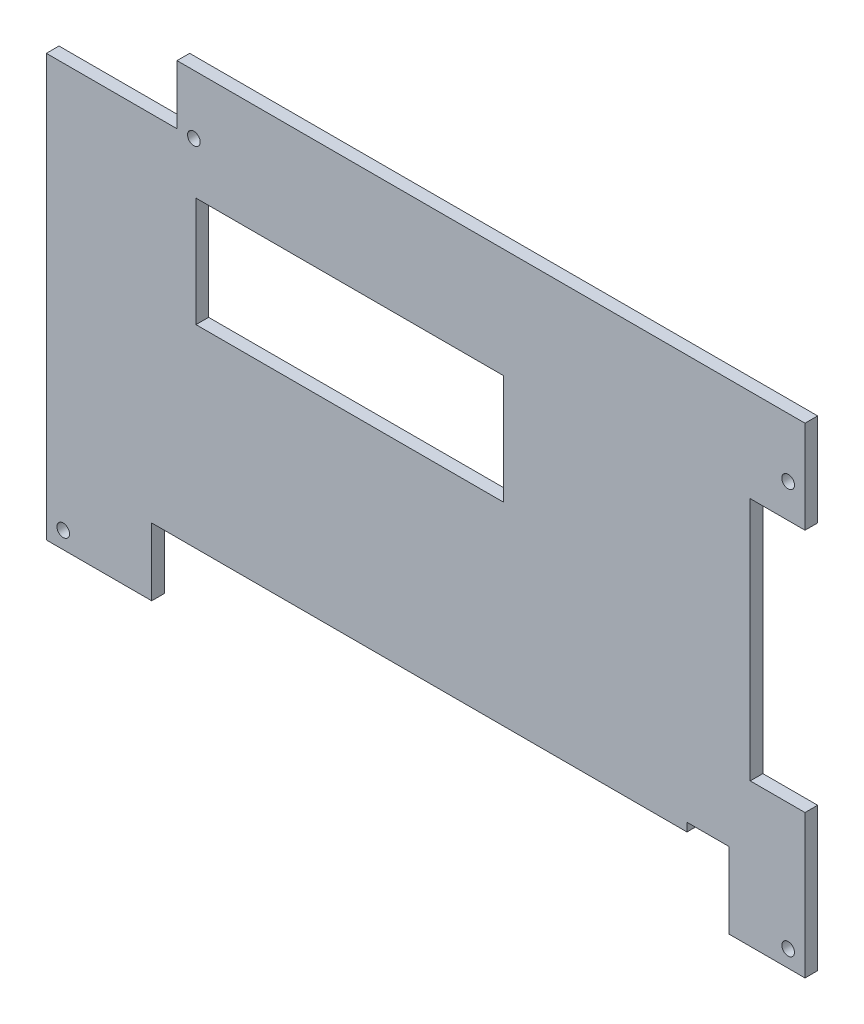
ISO-10303-21;
HEADER;
FILE_DESCRIPTION(('STEP AP214'),'2;1');
FILE_NAME('part.step','',(''),(''),'','','');
FILE_SCHEMA(('AUTOMOTIVE_DESIGN { 1 0 10303 214 1 1 1 1 }'));
ENDSEC;
DATA;
#1=APPLICATION_CONTEXT('core data for automotive mechanical design processes');
#2=APPLICATION_PROTOCOL_DEFINITION('international standard','automotive_design',2000,#1);
#3=PRODUCT_CONTEXT('',#1,'mechanical');
#4=PRODUCT('Part','Part','',(#3));
#5=PRODUCT_RELATED_PRODUCT_CATEGORY('part','',(#4));
#6=PRODUCT_DEFINITION_FORMATION('','',#4);
#7=PRODUCT_DEFINITION_CONTEXT('part definition',#1,'design');
#8=PRODUCT_DEFINITION('design','',#6,#7);
#9=PRODUCT_DEFINITION_SHAPE('','',#8);
#10=(LENGTH_UNIT() NAMED_UNIT(*) SI_UNIT(.MILLI.,.METRE.));
#11=(NAMED_UNIT(*) PLANE_ANGLE_UNIT() SI_UNIT($,.RADIAN.));
#12=(NAMED_UNIT(*) SI_UNIT($,.STERADIAN.) SOLID_ANGLE_UNIT());
#13=UNCERTAINTY_MEASURE_WITH_UNIT(LENGTH_MEASURE(1.E-05),#10,'distance_accuracy_value','');
#14=(GEOMETRIC_REPRESENTATION_CONTEXT(3) GLOBAL_UNCERTAINTY_ASSIGNED_CONTEXT((#13)) GLOBAL_UNIT_ASSIGNED_CONTEXT((#10,
#11,#12)) REPRESENTATION_CONTEXT('',''));
#15=CARTESIAN_POINT('',(0.,0.,0.));
#16=DIRECTION('',(0.,0.,1.));
#17=DIRECTION('',(1.,0.,0.));
#18=AXIS2_PLACEMENT_3D('',#15,#16,#17);
#19=CARTESIAN_POINT('',(-40.,9.00000000000001,-3.));
#20=DIRECTION('',(-1.,0.,0.));
#21=DIRECTION('',(0.,-1.,0.));
#22=AXIS2_PLACEMENT_3D('',#19,#20,#21);
#23=PLANE('',#22);
#24=DIRECTION('',(0.,-1.,0.));
#25=VECTOR('',#24,1.);
#26=CARTESIAN_POINT('',(-40.,9.00000000000001,0.));
#27=LINE('',#26,#25);
#28=CARTESIAN_POINT('',(-40.,9.00000000000001,0.));
#29=VERTEX_POINT('',#28);
#30=CARTESIAN_POINT('',(-40.,-91.,0.));
#31=VERTEX_POINT('',#30);
#32=EDGE_CURVE('E227',#29,#31,#27,.T.);
#33=ORIENTED_EDGE('',*,*,#32,.F.);
#34=DIRECTION('',(0.,0.,1.));
#35=VECTOR('',#34,1.);
#36=CARTESIAN_POINT('',(-40.,9.00000000000001,-3.));
#37=LINE('',#36,#35);
#38=CARTESIAN_POINT('',(-40.,9.00000000000001,-3.));
#39=VERTEX_POINT('',#38);
#40=EDGE_CURVE('E11',#39,#29,#37,.T.);
#41=ORIENTED_EDGE('',*,*,#40,.F.);
#42=DIRECTION('',(0.,-1.,0.));
#43=VECTOR('',#42,1.);
#44=CARTESIAN_POINT('',(-40.,9.00000000000001,-3.));
#45=LINE('',#44,#43);
#46=CARTESIAN_POINT('',(-40.,-91.,-3.));
#47=VERTEX_POINT('',#46);
#48=EDGE_CURVE('E230',#39,#47,#45,.T.);
#49=ORIENTED_EDGE('',*,*,#48,.T.);
#50=DIRECTION('',(0.,0.,1.));
#51=VECTOR('',#50,1.);
#52=CARTESIAN_POINT('',(-40.,-91.,-3.));
#53=LINE('',#52,#51);
#54=EDGE_CURVE('E35',#47,#31,#53,.T.);
#55=ORIENTED_EDGE('',*,*,#54,.T.);
#56=EDGE_LOOP('',(#33,#41,#49,#55));
#57=FACE_BOUND('',#56,.T.);
#58=ADVANCED_FACE('F32',(#57),#23,.T.);
#59=CARTESIAN_POINT('',(-40.,9.00000000000001,-3.));
#60=DIRECTION('',(0.,1.,0.));
#61=DIRECTION('',(0.,0.,1.));
#62=AXIS2_PLACEMENT_3D('',#59,#60,#61);
#63=PLANE('',#62);
#64=DIRECTION('',(-1.,0.,0.));
#65=VECTOR('',#64,1.);
#66=CARTESIAN_POINT('',(-40.,9.00000000000001,0.));
#67=LINE('',#66,#65);
#68=CARTESIAN_POINT('',(-8.99999999999999,9.00000000000001,0.));
#69=VERTEX_POINT('',#68);
#70=EDGE_CURVE('E234',#69,#29,#67,.T.);
#71=ORIENTED_EDGE('',*,*,#70,.F.);
#72=DIRECTION('',(0.,0.,1.));
#73=VECTOR('',#72,1.);
#74=CARTESIAN_POINT('',(-8.99999999999999,9.00000000000001,-3.));
#75=LINE('',#74,#73);
#76=CARTESIAN_POINT('',(-8.99999999999999,9.00000000000001,-3.));
#77=VERTEX_POINT('',#76);
#78=EDGE_CURVE('E40',#77,#69,#75,.T.);
#79=ORIENTED_EDGE('',*,*,#78,.F.);
#80=DIRECTION('',(-1.,0.,0.));
#81=VECTOR('',#80,1.);
#82=CARTESIAN_POINT('',(-40.,9.00000000000001,-3.));
#83=LINE('',#82,#81);
#84=EDGE_CURVE('E276',#77,#39,#83,.T.);
#85=ORIENTED_EDGE('',*,*,#84,.T.);
#86=ORIENTED_EDGE('',*,*,#40,.T.);
#87=EDGE_LOOP('',(#71,#79,#85,#86));
#88=FACE_BOUND('',#87,.T.);
#89=ADVANCED_FACE('F363',(#88),#63,.T.);
#90=CARTESIAN_POINT('',(-8.99999999999999,23.,-3.));
#91=DIRECTION('',(-1.,0.,0.));
#92=DIRECTION('',(0.,0.,1.));
#93=AXIS2_PLACEMENT_3D('',#90,#91,#92);
#94=PLANE('',#93);
#95=DIRECTION('',(0.,-1.,0.));
#96=VECTOR('',#95,1.);
#97=CARTESIAN_POINT('',(-8.99999999999999,23.,0.));
#98=LINE('',#97,#96);
#99=CARTESIAN_POINT('',(-8.99999999999999,23.,0.));
#100=VERTEX_POINT('',#99);
#101=EDGE_CURVE('E320',#100,#69,#98,.T.);
#102=ORIENTED_EDGE('',*,*,#101,.F.);
#103=DIRECTION('',(0.,0.,1.));
#104=VECTOR('',#103,1.);
#105=CARTESIAN_POINT('',(-8.99999999999999,23.,-3.));
#106=LINE('',#105,#104);
#107=CARTESIAN_POINT('',(-8.99999999999999,23.,-3.));
#108=VERTEX_POINT('',#107);
#109=EDGE_CURVE('E326',#108,#100,#106,.T.);
#110=ORIENTED_EDGE('',*,*,#109,.F.);
#111=DIRECTION('',(0.,-1.,0.));
#112=VECTOR('',#111,1.);
#113=CARTESIAN_POINT('',(-8.99999999999999,23.,-3.));
#114=LINE('',#113,#112);
#115=EDGE_CURVE('E273',#108,#77,#114,.T.);
#116=ORIENTED_EDGE('',*,*,#115,.T.);
#117=ORIENTED_EDGE('',*,*,#78,.T.);
#118=EDGE_LOOP('',(#102,#110,#116,#117));
#119=FACE_BOUND('',#118,.T.);
#120=ADVANCED_FACE('F415',(#119),#94,.T.);
#121=CARTESIAN_POINT('',(140.,23.,-3.));
#122=DIRECTION('',(0.,1.,0.));
#123=DIRECTION('',(-1.,0.,0.));
#124=AXIS2_PLACEMENT_3D('',#121,#122,#123);
#125=PLANE('',#124);
#126=DIRECTION('',(-1.,0.,0.));
#127=VECTOR('',#126,1.);
#128=CARTESIAN_POINT('',(140.,23.,0.));
#129=LINE('',#128,#127);
#130=CARTESIAN_POINT('',(140.,23.,0.));
#131=VERTEX_POINT('',#130);
#132=EDGE_CURVE('E317',#131,#100,#129,.T.);
#133=ORIENTED_EDGE('',*,*,#132,.F.);
#134=DIRECTION('',(0.,0.,1.));
#135=VECTOR('',#134,1.);
#136=CARTESIAN_POINT('',(140.,23.,-3.));
#137=LINE('',#136,#135);
#138=CARTESIAN_POINT('',(140.,23.,-3.));
#139=VERTEX_POINT('',#138);
#140=EDGE_CURVE('E328',#139,#131,#137,.T.);
#141=ORIENTED_EDGE('',*,*,#140,.F.);
#142=DIRECTION('',(-1.,0.,0.));
#143=VECTOR('',#142,1.);
#144=CARTESIAN_POINT('',(140.,23.,-3.));
#145=LINE('',#144,#143);
#146=EDGE_CURVE('E270',#139,#108,#145,.T.);
#147=ORIENTED_EDGE('',*,*,#146,.T.);
#148=ORIENTED_EDGE('',*,*,#109,.T.);
#149=EDGE_LOOP('',(#133,#141,#147,#148));
#150=FACE_BOUND('',#149,.T.);
#151=ADVANCED_FACE('F413',(#150),#125,.T.);
#152=CARTESIAN_POINT('',(140.,1.,-3.));
#153=DIRECTION('',(1.,0.,0.));
#154=DIRECTION('',(0.,0.,-1.));
#155=AXIS2_PLACEMENT_3D('',#152,#153,#154);
#156=PLANE('',#155);
#157=DIRECTION('',(0.,1.,0.));
#158=VECTOR('',#157,1.);
#159=CARTESIAN_POINT('',(140.,1.,0.));
#160=LINE('',#159,#158);
#161=CARTESIAN_POINT('',(140.,1.,0.));
#162=VERTEX_POINT('',#161);
#163=EDGE_CURVE('E314',#162,#131,#160,.T.);
#164=ORIENTED_EDGE('',*,*,#163,.F.);
#165=DIRECTION('',(0.,0.,1.));
#166=VECTOR('',#165,1.);
#167=CARTESIAN_POINT('',(140.,1.,-3.));
#168=LINE('',#167,#166);
#169=CARTESIAN_POINT('',(140.,1.,-3.));
#170=VERTEX_POINT('',#169);
#171=EDGE_CURVE('E330',#170,#162,#168,.T.);
#172=ORIENTED_EDGE('',*,*,#171,.F.);
#173=DIRECTION('',(0.,1.,0.));
#174=VECTOR('',#173,1.);
#175=CARTESIAN_POINT('',(140.,1.,-3.));
#176=LINE('',#175,#174);
#177=EDGE_CURVE('E267',#170,#139,#176,.T.);
#178=ORIENTED_EDGE('',*,*,#177,.T.);
#179=ORIENTED_EDGE('',*,*,#140,.T.);
#180=EDGE_LOOP('',(#164,#172,#178,#179));
#181=FACE_BOUND('',#180,.T.);
#182=ADVANCED_FACE('F409',(#181),#156,.T.);
#183=CARTESIAN_POINT('',(127.,1.,-3.));
#184=DIRECTION('',(0.,-1.,0.));
#185=DIRECTION('',(0.,0.,-1.));
#186=AXIS2_PLACEMENT_3D('',#183,#184,#185);
#187=PLANE('',#186);
#188=DIRECTION('',(1.,0.,0.));
#189=VECTOR('',#188,1.);
#190=CARTESIAN_POINT('',(127.,1.,0.));
#191=LINE('',#190,#189);
#192=CARTESIAN_POINT('',(127.,1.,0.));
#193=VERTEX_POINT('',#192);
#194=EDGE_CURVE('E311',#193,#162,#191,.T.);
#195=ORIENTED_EDGE('',*,*,#194,.F.);
#196=DIRECTION('',(0.,0.,1.));
#197=VECTOR('',#196,1.);
#198=CARTESIAN_POINT('',(127.,1.,-3.));
#199=LINE('',#198,#197);
#200=CARTESIAN_POINT('',(127.,1.,-3.));
#201=VERTEX_POINT('',#200);
#202=EDGE_CURVE('E332',#201,#193,#199,.T.);
#203=ORIENTED_EDGE('',*,*,#202,.F.);
#204=DIRECTION('',(1.,0.,0.));
#205=VECTOR('',#204,1.);
#206=CARTESIAN_POINT('',(127.,1.,-3.));
#207=LINE('',#206,#205);
#208=EDGE_CURVE('E264',#201,#170,#207,.T.);
#209=ORIENTED_EDGE('',*,*,#208,.T.);
#210=ORIENTED_EDGE('',*,*,#171,.T.);
#211=EDGE_LOOP('',(#195,#203,#209,#210));
#212=FACE_BOUND('',#211,.T.);
#213=ADVANCED_FACE('F405',(#212),#187,.T.);
#214=CARTESIAN_POINT('',(127.,-57.,-3.));
#215=DIRECTION('',(1.,0.,0.));
#216=DIRECTION('',(0.,0.,-1.));
#217=AXIS2_PLACEMENT_3D('',#214,#215,#216);
#218=PLANE('',#217);
#219=DIRECTION('',(0.,1.,0.));
#220=VECTOR('',#219,1.);
#221=CARTESIAN_POINT('',(127.,-57.,0.));
#222=LINE('',#221,#220);
#223=CARTESIAN_POINT('',(127.,-57.,0.));
#224=VERTEX_POINT('',#223);
#225=EDGE_CURVE('E308',#224,#193,#222,.T.);
#226=ORIENTED_EDGE('',*,*,#225,.F.);
#227=DIRECTION('',(0.,0.,1.));
#228=VECTOR('',#227,1.);
#229=CARTESIAN_POINT('',(127.,-57.,-3.));
#230=LINE('',#229,#228);
#231=CARTESIAN_POINT('',(127.,-57.,-3.));
#232=VERTEX_POINT('',#231);
#233=EDGE_CURVE('E334',#232,#224,#230,.T.);
#234=ORIENTED_EDGE('',*,*,#233,.F.);
#235=DIRECTION('',(0.,1.,0.));
#236=VECTOR('',#235,1.);
#237=CARTESIAN_POINT('',(127.,-57.,-3.));
#238=LINE('',#237,#236);
#239=EDGE_CURVE('E261',#232,#201,#238,.T.);
#240=ORIENTED_EDGE('',*,*,#239,.T.);
#241=ORIENTED_EDGE('',*,*,#202,.T.);
#242=EDGE_LOOP('',(#226,#234,#240,#241));
#243=FACE_BOUND('',#242,.T.);
#244=ADVANCED_FACE('F401',(#243),#218,.T.);
#245=CARTESIAN_POINT('',(140.,-57.,-3.));
#246=DIRECTION('',(0.,1.,0.));
#247=DIRECTION('',(0.,0.,1.));
#248=AXIS2_PLACEMENT_3D('',#245,#246,#247);
#249=PLANE('',#248);
#250=DIRECTION('',(-1.,0.,0.));
#251=VECTOR('',#250,1.);
#252=CARTESIAN_POINT('',(140.,-57.,0.));
#253=LINE('',#252,#251);
#254=CARTESIAN_POINT('',(140.,-57.,0.));
#255=VERTEX_POINT('',#254);
#256=EDGE_CURVE('E305',#255,#224,#253,.T.);
#257=ORIENTED_EDGE('',*,*,#256,.F.);
#258=DIRECTION('',(0.,0.,1.));
#259=VECTOR('',#258,1.);
#260=CARTESIAN_POINT('',(140.,-57.,-3.));
#261=LINE('',#260,#259);
#262=CARTESIAN_POINT('',(140.,-57.,-3.));
#263=VERTEX_POINT('',#262);
#264=EDGE_CURVE('E336',#263,#255,#261,.T.);
#265=ORIENTED_EDGE('',*,*,#264,.F.);
#266=DIRECTION('',(-1.,0.,0.));
#267=VECTOR('',#266,1.);
#268=CARTESIAN_POINT('',(140.,-57.,-3.));
#269=LINE('',#268,#267);
#270=EDGE_CURVE('E258',#263,#232,#269,.T.);
#271=ORIENTED_EDGE('',*,*,#270,.T.);
#272=ORIENTED_EDGE('',*,*,#233,.T.);
#273=EDGE_LOOP('',(#257,#265,#271,#272));
#274=FACE_BOUND('',#273,.T.);
#275=ADVANCED_FACE('F397',(#274),#249,.T.);
#276=CARTESIAN_POINT('',(140.,-91.,-3.));
#277=DIRECTION('',(1.,0.,0.));
#278=DIRECTION('',(0.,0.,-1.));
#279=AXIS2_PLACEMENT_3D('',#276,#277,#278);
#280=PLANE('',#279);
#281=DIRECTION('',(0.,1.,0.));
#282=VECTOR('',#281,1.);
#283=CARTESIAN_POINT('',(140.,-91.,0.));
#284=LINE('',#283,#282);
#285=CARTESIAN_POINT('',(140.,-91.,0.));
#286=VERTEX_POINT('',#285);
#287=EDGE_CURVE('E302',#286,#255,#284,.T.);
#288=ORIENTED_EDGE('',*,*,#287,.F.);
#289=DIRECTION('',(0.,0.,1.));
#290=VECTOR('',#289,1.);
#291=CARTESIAN_POINT('',(140.,-91.,-3.));
#292=LINE('',#291,#290);
#293=CARTESIAN_POINT('',(140.,-91.,-3.));
#294=VERTEX_POINT('',#293);
#295=EDGE_CURVE('E338',#294,#286,#292,.T.);
#296=ORIENTED_EDGE('',*,*,#295,.F.);
#297=DIRECTION('',(0.,1.,0.));
#298=VECTOR('',#297,1.);
#299=CARTESIAN_POINT('',(140.,-91.,-3.));
#300=LINE('',#299,#298);
#301=EDGE_CURVE('E255',#294,#263,#300,.T.);
#302=ORIENTED_EDGE('',*,*,#301,.T.);
#303=ORIENTED_EDGE('',*,*,#264,.T.);
#304=EDGE_LOOP('',(#288,#296,#302,#303));
#305=FACE_BOUND('',#304,.T.);
#306=ADVANCED_FACE('F393',(#305),#280,.T.);
#307=CARTESIAN_POINT('',(122.,-91.,-3.));
#308=DIRECTION('',(0.,-1.,0.));
#309=DIRECTION('',(0.,0.,-1.));
#310=AXIS2_PLACEMENT_3D('',#307,#308,#309);
#311=PLANE('',#310);
#312=DIRECTION('',(1.,0.,0.));
#313=VECTOR('',#312,1.);
#314=CARTESIAN_POINT('',(122.,-91.,0.));
#315=LINE('',#314,#313);
#316=CARTESIAN_POINT('',(122.,-91.,0.));
#317=VERTEX_POINT('',#316);
#318=EDGE_CURVE('E299',#317,#286,#315,.T.);
#319=ORIENTED_EDGE('',*,*,#318,.F.);
#320=DIRECTION('',(0.,0.,1.));
#321=VECTOR('',#320,1.);
#322=CARTESIAN_POINT('',(122.,-91.,-3.));
#323=LINE('',#322,#321);
#324=CARTESIAN_POINT('',(122.,-91.,-3.));
#325=VERTEX_POINT('',#324);
#326=EDGE_CURVE('E340',#325,#317,#323,.T.);
#327=ORIENTED_EDGE('',*,*,#326,.F.);
#328=DIRECTION('',(1.,0.,0.));
#329=VECTOR('',#328,1.);
#330=CARTESIAN_POINT('',(122.,-91.,-3.));
#331=LINE('',#330,#329);
#332=EDGE_CURVE('E252',#325,#294,#331,.T.);
#333=ORIENTED_EDGE('',*,*,#332,.T.);
#334=ORIENTED_EDGE('',*,*,#295,.T.);
#335=EDGE_LOOP('',(#319,#327,#333,#334));
#336=FACE_BOUND('',#335,.T.);
#337=ADVANCED_FACE('F389',(#336),#311,.T.);
#338=CARTESIAN_POINT('',(122.,-73.,-3.));
#339=DIRECTION('',(-1.,0.,0.));
#340=DIRECTION('',(0.,0.,1.));
#341=AXIS2_PLACEMENT_3D('',#338,#339,#340);
#342=PLANE('',#341);
#343=DIRECTION('',(0.,-1.,0.));
#344=VECTOR('',#343,1.);
#345=CARTESIAN_POINT('',(122.,-73.,0.));
#346=LINE('',#345,#344);
#347=CARTESIAN_POINT('',(122.,-73.,0.));
#348=VERTEX_POINT('',#347);
#349=EDGE_CURVE('E296',#348,#317,#346,.T.);
#350=ORIENTED_EDGE('',*,*,#349,.F.);
#351=DIRECTION('',(0.,0.,1.));
#352=VECTOR('',#351,1.);
#353=CARTESIAN_POINT('',(122.,-73.,-3.));
#354=LINE('',#353,#352);
#355=CARTESIAN_POINT('',(122.,-73.,-3.));
#356=VERTEX_POINT('',#355);
#357=EDGE_CURVE('E342',#356,#348,#354,.T.);
#358=ORIENTED_EDGE('',*,*,#357,.F.);
#359=DIRECTION('',(0.,-1.,0.));
#360=VECTOR('',#359,1.);
#361=CARTESIAN_POINT('',(122.,-73.,-3.));
#362=LINE('',#361,#360);
#363=EDGE_CURVE('E249',#356,#325,#362,.T.);
#364=ORIENTED_EDGE('',*,*,#363,.T.);
#365=ORIENTED_EDGE('',*,*,#326,.T.);
#366=EDGE_LOOP('',(#350,#358,#364,#365));
#367=FACE_BOUND('',#366,.T.);
#368=ADVANCED_FACE('F385',(#367),#342,.T.);
#369=CARTESIAN_POINT('',(112.,-73.,-3.));
#370=DIRECTION('',(0.,-1.,0.));
#371=DIRECTION('',(0.,0.,-1.));
#372=AXIS2_PLACEMENT_3D('',#369,#370,#371);
#373=PLANE('',#372);
#374=DIRECTION('',(1.,0.,0.));
#375=VECTOR('',#374,1.);
#376=CARTESIAN_POINT('',(112.,-73.,0.));
#377=LINE('',#376,#375);
#378=CARTESIAN_POINT('',(112.,-73.,0.));
#379=VERTEX_POINT('',#378);
#380=EDGE_CURVE('E293',#379,#348,#377,.T.);
#381=ORIENTED_EDGE('',*,*,#380,.F.);
#382=DIRECTION('',(0.,0.,1.));
#383=VECTOR('',#382,1.);
#384=CARTESIAN_POINT('',(112.,-73.,-3.));
#385=LINE('',#384,#383);
#386=CARTESIAN_POINT('',(112.,-73.,-3.));
#387=VERTEX_POINT('',#386);
#388=EDGE_CURVE('E344',#387,#379,#385,.T.);
#389=ORIENTED_EDGE('',*,*,#388,.F.);
#390=DIRECTION('',(1.,0.,0.));
#391=VECTOR('',#390,1.);
#392=CARTESIAN_POINT('',(112.,-73.,-3.));
#393=LINE('',#392,#391);
#394=EDGE_CURVE('E246',#387,#356,#393,.T.);
#395=ORIENTED_EDGE('',*,*,#394,.T.);
#396=ORIENTED_EDGE('',*,*,#357,.T.);
#397=EDGE_LOOP('',(#381,#389,#395,#396));
#398=FACE_BOUND('',#397,.T.);
#399=ADVANCED_FACE('F381',(#398),#373,.T.);
#400=CARTESIAN_POINT('',(112.,-75.,-3.));
#401=DIRECTION('',(1.,0.,0.));
#402=DIRECTION('',(0.,0.,-1.));
#403=AXIS2_PLACEMENT_3D('',#400,#401,#402);
#404=PLANE('',#403);
#405=DIRECTION('',(0.,1.,0.));
#406=VECTOR('',#405,1.);
#407=CARTESIAN_POINT('',(112.,-75.,0.));
#408=LINE('',#407,#406);
#409=CARTESIAN_POINT('',(112.,-75.,0.));
#410=VERTEX_POINT('',#409);
#411=EDGE_CURVE('E290',#410,#379,#408,.T.);
#412=ORIENTED_EDGE('',*,*,#411,.F.);
#413=DIRECTION('',(0.,0.,1.));
#414=VECTOR('',#413,1.);
#415=CARTESIAN_POINT('',(112.,-75.,-3.));
#416=LINE('',#415,#414);
#417=CARTESIAN_POINT('',(112.,-75.,-3.));
#418=VERTEX_POINT('',#417);
#419=EDGE_CURVE('E346',#418,#410,#416,.T.);
#420=ORIENTED_EDGE('',*,*,#419,.F.);
#421=DIRECTION('',(0.,1.,0.));
#422=VECTOR('',#421,1.);
#423=CARTESIAN_POINT('',(112.,-75.,-3.));
#424=LINE('',#423,#422);
#425=EDGE_CURVE('E243',#418,#387,#424,.T.);
#426=ORIENTED_EDGE('',*,*,#425,.T.);
#427=ORIENTED_EDGE('',*,*,#388,.T.);
#428=EDGE_LOOP('',(#412,#420,#426,#427));
#429=FACE_BOUND('',#428,.T.);
#430=ADVANCED_FACE('F377',(#429),#404,.T.);
#431=CARTESIAN_POINT('',(-14.9999999999999,-75.,-3.));
#432=DIRECTION('',(0.,-1.,0.));
#433=DIRECTION('',(0.,0.,-1.));
#434=AXIS2_PLACEMENT_3D('',#431,#432,#433);
#435=PLANE('',#434);
#436=DIRECTION('',(1.,0.,0.));
#437=VECTOR('',#436,1.);
#438=CARTESIAN_POINT('',(-14.9999999999999,-75.,0.));
#439=LINE('',#438,#437);
#440=CARTESIAN_POINT('',(-14.9999999999999,-75.,0.));
#441=VERTEX_POINT('',#440);
#442=EDGE_CURVE('E287',#441,#410,#439,.T.);
#443=ORIENTED_EDGE('',*,*,#442,.F.);
#444=DIRECTION('',(0.,0.,1.));
#445=VECTOR('',#444,1.);
#446=CARTESIAN_POINT('',(-14.9999999999999,-75.,-3.));
#447=LINE('',#446,#445);
#448=CARTESIAN_POINT('',(-14.9999999999999,-75.,-3.));
#449=VERTEX_POINT('',#448);
#450=EDGE_CURVE('E348',#449,#441,#447,.T.);
#451=ORIENTED_EDGE('',*,*,#450,.F.);
#452=DIRECTION('',(1.,0.,0.));
#453=VECTOR('',#452,1.);
#454=CARTESIAN_POINT('',(-14.9999999999999,-75.,-3.));
#455=LINE('',#454,#453);
#456=EDGE_CURVE('E240',#449,#418,#455,.T.);
#457=ORIENTED_EDGE('',*,*,#456,.T.);
#458=ORIENTED_EDGE('',*,*,#419,.T.);
#459=EDGE_LOOP('',(#443,#451,#457,#458));
#460=FACE_BOUND('',#459,.T.);
#461=ADVANCED_FACE('F375',(#460),#435,.T.);
#462=CARTESIAN_POINT('',(-14.9999999999999,-91.,-3.));
#463=DIRECTION('',(1.,0.,0.));
#464=DIRECTION('',(0.,0.,-1.));
#465=AXIS2_PLACEMENT_3D('',#462,#463,#464);
#466=PLANE('',#465);
#467=DIRECTION('',(0.,1.,0.));
#468=VECTOR('',#467,1.);
#469=CARTESIAN_POINT('',(-14.9999999999999,-91.,0.));
#470=LINE('',#469,#468);
#471=CARTESIAN_POINT('',(-14.9999999999999,-91.,0.));
#472=VERTEX_POINT('',#471);
#473=EDGE_CURVE('E284',#472,#441,#470,.T.);
#474=ORIENTED_EDGE('',*,*,#473,.F.);
#475=DIRECTION('',(0.,0.,1.));
#476=VECTOR('',#475,1.);
#477=CARTESIAN_POINT('',(-14.9999999999999,-91.,-3.));
#478=LINE('',#477,#476);
#479=CARTESIAN_POINT('',(-14.9999999999999,-91.,-3.));
#480=VERTEX_POINT('',#479);
#481=EDGE_CURVE('E349',#480,#472,#478,.T.);
#482=ORIENTED_EDGE('',*,*,#481,.F.);
#483=DIRECTION('',(0.,1.,0.));
#484=VECTOR('',#483,1.);
#485=CARTESIAN_POINT('',(-14.9999999999999,-91.,-3.));
#486=LINE('',#485,#484);
#487=EDGE_CURVE('E237',#480,#449,#486,.T.);
#488=ORIENTED_EDGE('',*,*,#487,.T.);
#489=ORIENTED_EDGE('',*,*,#450,.T.);
#490=EDGE_LOOP('',(#474,#482,#488,#489));
#491=FACE_BOUND('',#490,.T.);
#492=ADVANCED_FACE('F371',(#491),#466,.T.);
#493=CARTESIAN_POINT('',(-40.,-91.,-3.));
#494=DIRECTION('',(0.,-1.,0.));
#495=DIRECTION('',(0.,0.,-1.));
#496=AXIS2_PLACEMENT_3D('',#493,#494,#495);
#497=PLANE('',#496);
#498=DIRECTION('',(1.,0.,0.));
#499=VECTOR('',#498,1.);
#500=CARTESIAN_POINT('',(-40.,-91.,0.));
#501=LINE('',#500,#499);
#502=EDGE_CURVE('E281',#31,#472,#501,.T.);
#503=ORIENTED_EDGE('',*,*,#502,.F.);
#504=ORIENTED_EDGE('',*,*,#54,.F.);
#505=DIRECTION('',(1.,0.,0.));
#506=VECTOR('',#505,1.);
#507=CARTESIAN_POINT('',(-40.,-91.,-3.));
#508=LINE('',#507,#506);
#509=EDGE_CURVE('E233',#47,#480,#508,.T.);
#510=ORIENTED_EDGE('',*,*,#509,.T.);
#511=ORIENTED_EDGE('',*,*,#481,.T.);
#512=EDGE_LOOP('',(#503,#504,#510,#511));
#513=FACE_BOUND('',#512,.T.);
#514=ADVANCED_FACE('F357',(#513),#497,.T.);
#515=CARTESIAN_POINT('',(0.,0.,-3.));
#516=DIRECTION('',(0.,0.,1.));
#517=DIRECTION('',(1.,0.,0.));
#518=AXIS2_PLACEMENT_3D('',#515,#516,#517);
#519=PLANE('',#518);
#520=DIRECTION('',(-1.,0.,0.));
#521=VECTOR('',#520,1.);
#522=CARTESIAN_POINT('',(-4.49999999999999,-3.,-3.));
#523=LINE('',#522,#521);
#524=CARTESIAN_POINT('',(68.5,-3.,-3.));
#525=VERTEX_POINT('',#524);
#526=CARTESIAN_POINT('',(-4.49999999999999,-3.,-3.));
#527=VERTEX_POINT('',#526);
#528=EDGE_CURVE('E177',#525,#527,#523,.T.);
#529=ORIENTED_EDGE('',*,*,#528,.T.);
#530=DIRECTION('',(0.,-1.,0.));
#531=VECTOR('',#530,1.);
#532=CARTESIAN_POINT('',(-4.49999999999999,-29.,-3.));
#533=LINE('',#532,#531);
#534=CARTESIAN_POINT('',(-4.49999999999999,-29.,-3.));
#535=VERTEX_POINT('',#534);
#536=EDGE_CURVE('E171',#527,#535,#533,.T.);
#537=ORIENTED_EDGE('',*,*,#536,.T.);
#538=DIRECTION('',(1.,0.,0.));
#539=VECTOR('',#538,1.);
#540=CARTESIAN_POINT('',(-4.49999999999999,-29.,-3.));
#541=LINE('',#540,#539);
#542=CARTESIAN_POINT('',(68.5,-29.,-3.));
#543=VERTEX_POINT('',#542);
#544=EDGE_CURVE('E180',#535,#543,#541,.T.);
#545=ORIENTED_EDGE('',*,*,#544,.T.);
#546=DIRECTION('',(0.,1.,0.));
#547=VECTOR('',#546,1.);
#548=CARTESIAN_POINT('',(68.5,-29.,-3.));
#549=LINE('',#548,#547);
#550=EDGE_CURVE('E48',#543,#525,#549,.T.);
#551=ORIENTED_EDGE('',*,*,#550,.T.);
#552=EDGE_LOOP('',(#529,#537,#545,#551));
#553=FACE_BOUND('',#552,.T.);
#554=CARTESIAN_POINT('',(-36.,-87.,-3.));
#555=DIRECTION('',(0.,0.,1.));
#556=DIRECTION('',(1.,0.,0.));
#557=AXIS2_PLACEMENT_3D('',#554,#555,#556);
#558=CIRCLE('',#557,1.5);
#559=CARTESIAN_POINT('',(-34.5,-87.,-3.));
#560=VERTEX_POINT('',#559);
#561=EDGE_CURVE('E206',#560,#560,#558,.T.);
#562=ORIENTED_EDGE('',*,*,#561,.T.);
#563=EDGE_LOOP('',(#562));
#564=FACE_BOUND('',#563,.T.);
#565=CARTESIAN_POINT('',(136.,-87.,-3.));
#566=DIRECTION('',(0.,0.,1.));
#567=DIRECTION('',(1.,0.,0.));
#568=AXIS2_PLACEMENT_3D('',#565,#566,#567);
#569=CIRCLE('',#568,1.5);
#570=CARTESIAN_POINT('',(137.5,-87.,-3.));
#571=VERTEX_POINT('',#570);
#572=EDGE_CURVE('E212',#571,#571,#569,.T.);
#573=ORIENTED_EDGE('',*,*,#572,.T.);
#574=EDGE_LOOP('',(#573));
#575=FACE_BOUND('',#574,.T.);
#576=CARTESIAN_POINT('',(136.,9.00000000000001,-3.));
#577=DIRECTION('',(0.,0.,1.));
#578=DIRECTION('',(1.,0.,0.));
#579=AXIS2_PLACEMENT_3D('',#576,#577,#578);
#580=CIRCLE('',#579,1.5);
#581=CARTESIAN_POINT('',(137.5,9.00000000000001,-3.));
#582=VERTEX_POINT('',#581);
#583=EDGE_CURVE('E218',#582,#582,#580,.T.);
#584=ORIENTED_EDGE('',*,*,#583,.T.);
#585=EDGE_LOOP('',(#584));
#586=FACE_BOUND('',#585,.T.);
#587=CARTESIAN_POINT('',(-4.99999999999999,9.00000000000001,-3.));
#588=DIRECTION('',(0.,0.,1.));
#589=DIRECTION('',(1.,0.,0.));
#590=AXIS2_PLACEMENT_3D('',#587,#588,#589);
#591=CIRCLE('',#590,1.49999999999999);
#592=CARTESIAN_POINT('',(-3.5,9.00000000000001,-3.));
#593=VERTEX_POINT('',#592);
#594=EDGE_CURVE('E224',#593,#593,#591,.T.);
#595=ORIENTED_EDGE('',*,*,#594,.T.);
#596=EDGE_LOOP('',(#595));
#597=FACE_BOUND('',#596,.T.);
#598=ORIENTED_EDGE('',*,*,#48,.F.);
#599=ORIENTED_EDGE('',*,*,#84,.F.);
#600=ORIENTED_EDGE('',*,*,#115,.F.);
#601=ORIENTED_EDGE('',*,*,#146,.F.);
#602=ORIENTED_EDGE('',*,*,#177,.F.);
#603=ORIENTED_EDGE('',*,*,#208,.F.);
#604=ORIENTED_EDGE('',*,*,#239,.F.);
#605=ORIENTED_EDGE('',*,*,#270,.F.);
#606=ORIENTED_EDGE('',*,*,#301,.F.);
#607=ORIENTED_EDGE('',*,*,#332,.F.);
#608=ORIENTED_EDGE('',*,*,#363,.F.);
#609=ORIENTED_EDGE('',*,*,#394,.F.);
#610=ORIENTED_EDGE('',*,*,#425,.F.);
#611=ORIENTED_EDGE('',*,*,#456,.F.);
#612=ORIENTED_EDGE('',*,*,#487,.F.);
#613=ORIENTED_EDGE('',*,*,#509,.F.);
#614=EDGE_LOOP('',(#598,#599,#600,#601,#602,#603,#604,#605,#606,#607,#608,#609,#610,#611,#612,#613));
#615=FACE_BOUND('',#614,.T.);
#616=ADVANCED_FACE('F184',(#553,#564,#575,#586,#597,#615),#519,.F.);
#617=CARTESIAN_POINT('',(0.,0.,0.));
#618=DIRECTION('',(0.,0.,1.));
#619=DIRECTION('',(1.,0.,0.));
#620=AXIS2_PLACEMENT_3D('',#617,#618,#619);
#621=PLANE('',#620);
#622=DIRECTION('',(0.,-1.,0.));
#623=VECTOR('',#622,1.);
#624=CARTESIAN_POINT('',(-4.49999999999999,-29.,0.));
#625=LINE('',#624,#623);
#626=CARTESIAN_POINT('',(-4.49999999999999,-3.,0.));
#627=VERTEX_POINT('',#626);
#628=CARTESIAN_POINT('',(-4.49999999999999,-29.,0.));
#629=VERTEX_POINT('',#628);
#630=EDGE_CURVE('E56',#627,#629,#625,.T.);
#631=ORIENTED_EDGE('',*,*,#630,.F.);
#632=DIRECTION('',(-1.,0.,0.));
#633=VECTOR('',#632,1.);
#634=CARTESIAN_POINT('',(-4.49999999999999,-3.,0.));
#635=LINE('',#634,#633);
#636=CARTESIAN_POINT('',(68.5,-3.,0.));
#637=VERTEX_POINT('',#636);
#638=EDGE_CURVE('E187',#637,#627,#635,.T.);
#639=ORIENTED_EDGE('',*,*,#638,.F.);
#640=DIRECTION('',(0.,1.,0.));
#641=VECTOR('',#640,1.);
#642=CARTESIAN_POINT('',(68.5,-29.,0.));
#643=LINE('',#642,#641);
#644=CARTESIAN_POINT('',(68.5,-29.,0.));
#645=VERTEX_POINT('',#644);
#646=EDGE_CURVE('E190',#645,#637,#643,.T.);
#647=ORIENTED_EDGE('',*,*,#646,.F.);
#648=DIRECTION('',(1.,0.,0.));
#649=VECTOR('',#648,1.);
#650=CARTESIAN_POINT('',(-4.49999999999999,-29.,0.));
#651=LINE('',#650,#649);
#652=EDGE_CURVE('E196',#629,#645,#651,.T.);
#653=ORIENTED_EDGE('',*,*,#652,.F.);
#654=EDGE_LOOP('',(#631,#639,#647,#653));
#655=FACE_BOUND('',#654,.T.);
#656=CARTESIAN_POINT('',(-36.,-87.,0.));
#657=DIRECTION('',(0.,0.,1.));
#658=DIRECTION('',(1.,0.,0.));
#659=AXIS2_PLACEMENT_3D('',#656,#657,#658);
#660=CIRCLE('',#659,1.5);
#661=CARTESIAN_POINT('',(-34.5,-87.,0.));
#662=VERTEX_POINT('',#661);
#663=EDGE_CURVE('E202',#662,#662,#660,.T.);
#664=ORIENTED_EDGE('',*,*,#663,.F.);
#665=EDGE_LOOP('',(#664));
#666=FACE_BOUND('',#665,.T.);
#667=CARTESIAN_POINT('',(136.,-87.,0.));
#668=DIRECTION('',(0.,0.,1.));
#669=DIRECTION('',(1.,0.,0.));
#670=AXIS2_PLACEMENT_3D('',#667,#668,#669);
#671=CIRCLE('',#670,1.5);
#672=CARTESIAN_POINT('',(137.5,-87.,0.));
#673=VERTEX_POINT('',#672);
#674=EDGE_CURVE('E209',#673,#673,#671,.T.);
#675=ORIENTED_EDGE('',*,*,#674,.F.);
#676=EDGE_LOOP('',(#675));
#677=FACE_BOUND('',#676,.T.);
#678=CARTESIAN_POINT('',(136.,9.00000000000001,0.));
#679=DIRECTION('',(0.,0.,1.));
#680=DIRECTION('',(1.,0.,0.));
#681=AXIS2_PLACEMENT_3D('',#678,#679,#680);
#682=CIRCLE('',#681,1.5);
#683=CARTESIAN_POINT('',(137.5,9.00000000000001,0.));
#684=VERTEX_POINT('',#683);
#685=EDGE_CURVE('E215',#684,#684,#682,.T.);
#686=ORIENTED_EDGE('',*,*,#685,.F.);
#687=EDGE_LOOP('',(#686));
#688=FACE_BOUND('',#687,.T.);
#689=CARTESIAN_POINT('',(-4.99999999999999,9.00000000000001,0.));
#690=DIRECTION('',(0.,0.,1.));
#691=DIRECTION('',(1.,0.,0.));
#692=AXIS2_PLACEMENT_3D('',#689,#690,#691);
#693=CIRCLE('',#692,1.49999999999999);
#694=CARTESIAN_POINT('',(-3.5,9.00000000000001,0.));
#695=VERTEX_POINT('',#694);
#696=EDGE_CURVE('E221',#695,#695,#693,.T.);
#697=ORIENTED_EDGE('',*,*,#696,.F.);
#698=EDGE_LOOP('',(#697));
#699=FACE_BOUND('',#698,.T.);
#700=ORIENTED_EDGE('',*,*,#32,.T.);
#701=ORIENTED_EDGE('',*,*,#502,.T.);
#702=ORIENTED_EDGE('',*,*,#473,.T.);
#703=ORIENTED_EDGE('',*,*,#442,.T.);
#704=ORIENTED_EDGE('',*,*,#411,.T.);
#705=ORIENTED_EDGE('',*,*,#380,.T.);
#706=ORIENTED_EDGE('',*,*,#349,.T.);
#707=ORIENTED_EDGE('',*,*,#318,.T.);
#708=ORIENTED_EDGE('',*,*,#287,.T.);
#709=ORIENTED_EDGE('',*,*,#256,.T.);
#710=ORIENTED_EDGE('',*,*,#225,.T.);
#711=ORIENTED_EDGE('',*,*,#194,.T.);
#712=ORIENTED_EDGE('',*,*,#163,.T.);
#713=ORIENTED_EDGE('',*,*,#132,.T.);
#714=ORIENTED_EDGE('',*,*,#101,.T.);
#715=ORIENTED_EDGE('',*,*,#70,.T.);
#716=EDGE_LOOP('',(#700,#701,#702,#703,#704,#705,#706,#707,#708,#709,#710,#711,#712,#713,#714,#715));
#717=FACE_BOUND('',#716,.T.);
#718=ADVANCED_FACE('F359',(#655,#666,#677,#688,#699,#717),#621,.T.);
#719=CARTESIAN_POINT('',(-4.99999999999999,9.00000000000001,-3.));
#720=DIRECTION('',(0.,0.,1.));
#721=DIRECTION('',(1.,0.,0.));
#722=AXIS2_PLACEMENT_3D('',#719,#720,#721);
#723=CYLINDRICAL_SURFACE('',#722,1.49999999999999);
#724=ORIENTED_EDGE('',*,*,#594,.F.);
#725=EDGE_LOOP('',(#724));
#726=FACE_BOUND('',#725,.T.);
#727=ORIENTED_EDGE('',*,*,#696,.T.);
#728=EDGE_LOOP('',(#727));
#729=FACE_BOUND('',#728,.T.);
#730=ADVANCED_FACE('F553',(#726,#729),#723,.F.);
#731=CARTESIAN_POINT('',(136.,9.00000000000001,-3.));
#732=DIRECTION('',(0.,0.,1.));
#733=DIRECTION('',(1.,0.,0.));
#734=AXIS2_PLACEMENT_3D('',#731,#732,#733);
#735=CYLINDRICAL_SURFACE('',#734,1.5);
#736=ORIENTED_EDGE('',*,*,#583,.F.);
#737=EDGE_LOOP('',(#736));
#738=FACE_BOUND('',#737,.T.);
#739=ORIENTED_EDGE('',*,*,#685,.T.);
#740=EDGE_LOOP('',(#739));
#741=FACE_BOUND('',#740,.T.);
#742=ADVANCED_FACE('F563',(#738,#741),#735,.F.);
#743=CARTESIAN_POINT('',(136.,-87.,-3.));
#744=DIRECTION('',(0.,0.,1.));
#745=DIRECTION('',(1.,0.,0.));
#746=AXIS2_PLACEMENT_3D('',#743,#744,#745);
#747=CYLINDRICAL_SURFACE('',#746,1.5);
#748=ORIENTED_EDGE('',*,*,#572,.F.);
#749=EDGE_LOOP('',(#748));
#750=FACE_BOUND('',#749,.T.);
#751=ORIENTED_EDGE('',*,*,#674,.T.);
#752=EDGE_LOOP('',(#751));
#753=FACE_BOUND('',#752,.T.);
#754=ADVANCED_FACE('F573',(#750,#753),#747,.F.);
#755=CARTESIAN_POINT('',(-36.,-87.,-3.));
#756=DIRECTION('',(0.,0.,1.));
#757=DIRECTION('',(1.,0.,0.));
#758=AXIS2_PLACEMENT_3D('',#755,#756,#757);
#759=CYLINDRICAL_SURFACE('',#758,1.5);
#760=ORIENTED_EDGE('',*,*,#561,.F.);
#761=EDGE_LOOP('',(#760));
#762=FACE_BOUND('',#761,.T.);
#763=ORIENTED_EDGE('',*,*,#663,.T.);
#764=EDGE_LOOP('',(#763));
#765=FACE_BOUND('',#764,.T.);
#766=ADVANCED_FACE('F583',(#762,#765),#759,.F.);
#767=CARTESIAN_POINT('',(-4.49999999999999,-29.,-3.));
#768=DIRECTION('',(-1.,0.,0.));
#769=DIRECTION('',(0.,0.,1.));
#770=AXIS2_PLACEMENT_3D('',#767,#768,#769);
#771=PLANE('',#770);
#772=ORIENTED_EDGE('',*,*,#630,.T.);
#773=DIRECTION('',(0.,0.,1.));
#774=VECTOR('',#773,1.);
#775=CARTESIAN_POINT('',(-4.49999999999999,-29.,-3.));
#776=LINE('',#775,#774);
#777=EDGE_CURVE('E167',#535,#629,#776,.T.);
#778=ORIENTED_EDGE('',*,*,#777,.F.);
#779=ORIENTED_EDGE('',*,*,#536,.F.);
#780=DIRECTION('',(0.,0.,1.));
#781=VECTOR('',#780,1.);
#782=CARTESIAN_POINT('',(-4.49999999999999,-3.,-3.));
#783=LINE('',#782,#781);
#784=EDGE_CURVE('E200',#527,#627,#783,.T.);
#785=ORIENTED_EDGE('',*,*,#784,.T.);
#786=EDGE_LOOP('',(#772,#778,#779,#785));
#787=FACE_BOUND('',#786,.T.);
#788=ADVANCED_FACE('F169',(#787),#771,.F.);
#789=CARTESIAN_POINT('',(-4.49999999999999,-3.,-3.));
#790=DIRECTION('',(0.,1.,0.));
#791=DIRECTION('',(0.,0.,1.));
#792=AXIS2_PLACEMENT_3D('',#789,#790,#791);
#793=PLANE('',#792);
#794=ORIENTED_EDGE('',*,*,#638,.T.);
#795=ORIENTED_EDGE('',*,*,#784,.F.);
#796=ORIENTED_EDGE('',*,*,#528,.F.);
#797=DIRECTION('',(0.,0.,1.));
#798=VECTOR('',#797,1.);
#799=CARTESIAN_POINT('',(68.5,-3.,-3.));
#800=LINE('',#799,#798);
#801=EDGE_CURVE('E203',#525,#637,#800,.T.);
#802=ORIENTED_EDGE('',*,*,#801,.T.);
#803=EDGE_LOOP('',(#794,#795,#796,#802));
#804=FACE_BOUND('',#803,.T.);
#805=ADVANCED_FACE('F602',(#804),#793,.F.);
#806=CARTESIAN_POINT('',(68.5,-29.,-3.));
#807=DIRECTION('',(1.,0.,0.));
#808=DIRECTION('',(0.,0.,-1.));
#809=AXIS2_PLACEMENT_3D('',#806,#807,#808);
#810=PLANE('',#809);
#811=ORIENTED_EDGE('',*,*,#646,.T.);
#812=ORIENTED_EDGE('',*,*,#801,.F.);
#813=ORIENTED_EDGE('',*,*,#550,.F.);
#814=DIRECTION('',(0.,0.,1.));
#815=VECTOR('',#814,1.);
#816=CARTESIAN_POINT('',(68.5,-29.,-3.));
#817=LINE('',#816,#815);
#818=EDGE_CURVE('E176',#543,#645,#817,.T.);
#819=ORIENTED_EDGE('',*,*,#818,.T.);
#820=EDGE_LOOP('',(#811,#812,#813,#819));
#821=FACE_BOUND('',#820,.T.);
#822=ADVANCED_FACE('F611',(#821),#810,.F.);
#823=CARTESIAN_POINT('',(-4.49999999999999,-29.,-3.));
#824=DIRECTION('',(0.,-1.,0.));
#825=DIRECTION('',(0.,0.,-1.));
#826=AXIS2_PLACEMENT_3D('',#823,#824,#825);
#827=PLANE('',#826);
#828=ORIENTED_EDGE('',*,*,#652,.T.);
#829=ORIENTED_EDGE('',*,*,#818,.F.);
#830=ORIENTED_EDGE('',*,*,#544,.F.);
#831=ORIENTED_EDGE('',*,*,#777,.T.);
#832=EDGE_LOOP('',(#828,#829,#830,#831));
#833=FACE_BOUND('',#832,.T.);
#834=ADVANCED_FACE('F181',(#833),#827,.F.);
#835=CLOSED_SHELL('',(#58,#89,#120,#151,#182,#213,#244,#275,#306,#337,#368,#399,#430,#461,#492,
#514,#616,#718,#730,#742,#754,#766,#788,#805,#822,#834));
#836=MANIFOLD_SOLID_BREP('B2',#835);
#837=ADVANCED_BREP_SHAPE_REPRESENTATION('',(#18,#836),#14);
#838=SHAPE_DEFINITION_REPRESENTATION(#9,#837);
ENDSEC;
END-ISO-10303-21;
